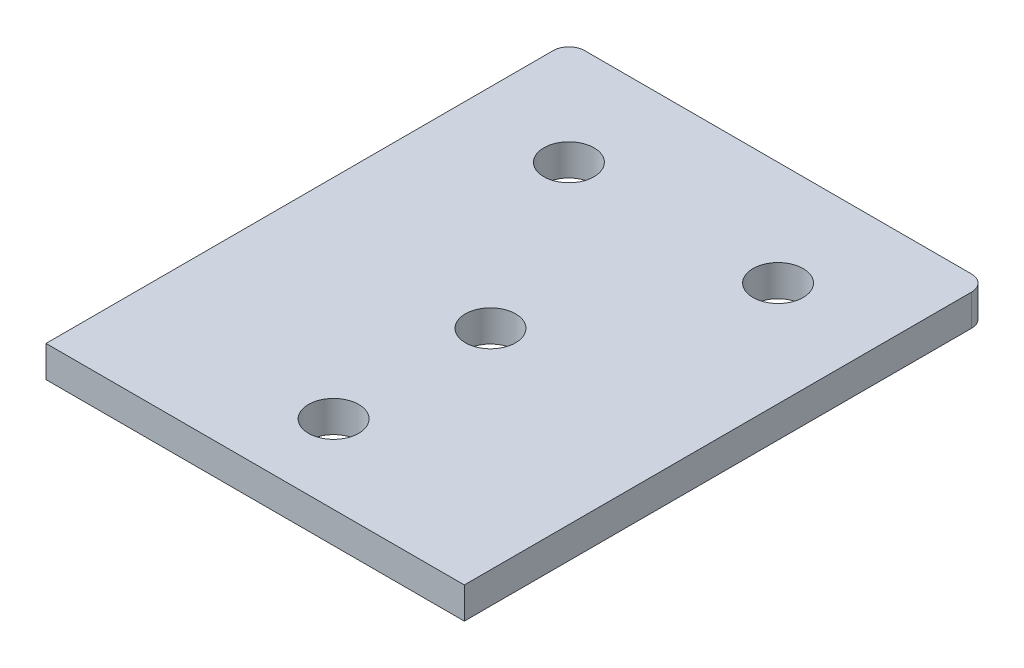
ISO-10303-21;
HEADER;
FILE_DESCRIPTION(('STEP AP214'),'2;1');
FILE_NAME('part.step','',(''),(''),'','','');
FILE_SCHEMA(('AUTOMOTIVE_DESIGN { 1 0 10303 214 1 1 1 1 }'));
ENDSEC;
DATA;
#1=APPLICATION_CONTEXT('core data for automotive mechanical design processes');
#2=APPLICATION_PROTOCOL_DEFINITION('international standard','automotive_design',2000,#1);
#3=PRODUCT_CONTEXT('',#1,'mechanical');
#4=PRODUCT('Part','Part','',(#3));
#5=PRODUCT_RELATED_PRODUCT_CATEGORY('part','',(#4));
#6=PRODUCT_DEFINITION_FORMATION('','',#4);
#7=PRODUCT_DEFINITION_CONTEXT('part definition',#1,'design');
#8=PRODUCT_DEFINITION('design','',#6,#7);
#9=PRODUCT_DEFINITION_SHAPE('','',#8);
#10=(LENGTH_UNIT() NAMED_UNIT(*) SI_UNIT(.MILLI.,.METRE.));
#11=(NAMED_UNIT(*) PLANE_ANGLE_UNIT() SI_UNIT($,.RADIAN.));
#12=(NAMED_UNIT(*) SI_UNIT($,.STERADIAN.) SOLID_ANGLE_UNIT());
#13=UNCERTAINTY_MEASURE_WITH_UNIT(LENGTH_MEASURE(1.E-05),#10,'distance_accuracy_value','');
#14=(GEOMETRIC_REPRESENTATION_CONTEXT(3) GLOBAL_UNCERTAINTY_ASSIGNED_CONTEXT((#13)) GLOBAL_UNIT_ASSIGNED_CONTEXT((#10,
#11,#12)) REPRESENTATION_CONTEXT('',''));
#15=CARTESIAN_POINT('',(0.,0.,0.));
#16=DIRECTION('',(0.,0.,1.));
#17=DIRECTION('',(1.,0.,0.));
#18=AXIS2_PLACEMENT_3D('',#15,#16,#17);
#19=CARTESIAN_POINT('',(-18.5,3.,-8.5));
#20=DIRECTION('',(0.,1.,0.));
#21=DIRECTION('',(0.,0.,1.));
#22=AXIS2_PLACEMENT_3D('',#19,#20,#21);
#23=PLANE('',#22);
#24=CARTESIAN_POINT('',(-10.,3.,0.));
#25=DIRECTION('',(0.,1.,0.));
#26=DIRECTION('',(0.,0.,1.));
#27=AXIS2_PLACEMENT_3D('',#24,#25,#26);
#28=CIRCLE('',#27,2.4);
#29=CARTESIAN_POINT('',(-10.,3.,2.4));
#30=VERTEX_POINT('',#29);
#31=EDGE_CURVE('E199',#30,#30,#28,.T.);
#32=ORIENTED_EDGE('',*,*,#31,.F.);
#33=EDGE_LOOP('',(#32));
#34=FACE_BOUND('',#33,.T.);
#35=CARTESIAN_POINT('',(0.,3.,32.5));
#36=DIRECTION('',(0.,1.,0.));
#37=DIRECTION('',(0.,0.,1.));
#38=AXIS2_PLACEMENT_3D('',#35,#36,#37);
#39=CIRCLE('',#38,2.4);
#40=CARTESIAN_POINT('',(0.,3.,34.9));
#41=VERTEX_POINT('',#40);
#42=EDGE_CURVE('E132',#41,#41,#39,.T.);
#43=ORIENTED_EDGE('',*,*,#42,.F.);
#44=EDGE_LOOP('',(#43));
#45=FACE_BOUND('',#44,.T.);
#46=CARTESIAN_POINT('',(-18.5,3.,-8.5));
#47=DIRECTION('',(0.,1.,0.));
#48=DIRECTION('',(0.,0.,1.));
#49=AXIS2_PLACEMENT_3D('',#46,#47,#48);
#50=CIRCLE('',#49,1.5);
#51=CARTESIAN_POINT('',(-18.5,3.,-10.));
#52=VERTEX_POINT('',#51);
#53=CARTESIAN_POINT('',(-20.,3.,-8.49999999999999));
#54=VERTEX_POINT('',#53);
#55=EDGE_CURVE('E139',#52,#54,#50,.T.);
#56=ORIENTED_EDGE('',*,*,#55,.T.);
#57=DIRECTION('',(0.,0.,1.));
#58=VECTOR('',#57,1.);
#59=CARTESIAN_POINT('',(-20.,3.,-8.49999999999999));
#60=LINE('',#59,#58);
#61=CARTESIAN_POINT('',(-20.,3.,40.));
#62=VERTEX_POINT('',#61);
#63=EDGE_CURVE('E97',#54,#62,#60,.T.);
#64=ORIENTED_EDGE('',*,*,#63,.T.);
#65=DIRECTION('',(1.,0.,0.));
#66=VECTOR('',#65,1.);
#67=CARTESIAN_POINT('',(-20.,3.,40.));
#68=LINE('',#67,#66);
#69=CARTESIAN_POINT('',(20.,3.,40.));
#70=VERTEX_POINT('',#69);
#71=EDGE_CURVE('E110',#62,#70,#68,.T.);
#72=ORIENTED_EDGE('',*,*,#71,.T.);
#73=DIRECTION('',(0.,0.,-1.));
#74=VECTOR('',#73,1.);
#75=CARTESIAN_POINT('',(20.,3.,-8.49999999999999));
#76=LINE('',#75,#74);
#77=CARTESIAN_POINT('',(20.,3.,-8.49999999999999));
#78=VERTEX_POINT('',#77);
#79=EDGE_CURVE('E104',#70,#78,#76,.T.);
#80=ORIENTED_EDGE('',*,*,#79,.T.);
#81=CARTESIAN_POINT('',(18.5,3.,-8.5));
#82=DIRECTION('',(0.,1.,0.));
#83=DIRECTION('',(0.,0.,-1.));
#84=AXIS2_PLACEMENT_3D('',#81,#82,#83);
#85=CIRCLE('',#84,1.5);
#86=CARTESIAN_POINT('',(18.5,3.,-10.));
#87=VERTEX_POINT('',#86);
#88=EDGE_CURVE('E108',#78,#87,#85,.T.);
#89=ORIENTED_EDGE('',*,*,#88,.T.);
#90=DIRECTION('',(-1.,0.,0.));
#91=VECTOR('',#90,1.);
#92=CARTESIAN_POINT('',(-18.5,3.,-10.));
#93=LINE('',#92,#91);
#94=EDGE_CURVE('E60',#87,#52,#93,.T.);
#95=ORIENTED_EDGE('',*,*,#94,.T.);
#96=EDGE_LOOP('',(#56,#64,#72,#80,#89,#95));
#97=FACE_BOUND('',#96,.T.);
#98=CARTESIAN_POINT('',(0.,3.,17.5));
#99=DIRECTION('',(0.,1.,0.));
#100=DIRECTION('',(0.,0.,1.));
#101=AXIS2_PLACEMENT_3D('',#98,#99,#100);
#102=CIRCLE('',#101,2.4);
#103=CARTESIAN_POINT('',(0.,3.,19.9));
#104=VERTEX_POINT('',#103);
#105=EDGE_CURVE('E205',#104,#104,#102,.T.);
#106=ORIENTED_EDGE('',*,*,#105,.F.);
#107=EDGE_LOOP('',(#106));
#108=FACE_BOUND('',#107,.T.);
#109=CARTESIAN_POINT('',(10.,3.,0.));
#110=DIRECTION('',(0.,1.,0.));
#111=DIRECTION('',(0.,0.,1.));
#112=AXIS2_PLACEMENT_3D('',#109,#110,#111);
#113=CIRCLE('',#112,2.4);
#114=CARTESIAN_POINT('',(10.,3.,2.4));
#115=VERTEX_POINT('',#114);
#116=EDGE_CURVE('E190',#115,#115,#113,.T.);
#117=ORIENTED_EDGE('',*,*,#116,.F.);
#118=EDGE_LOOP('',(#117));
#119=FACE_BOUND('',#118,.T.);
#120=ADVANCED_FACE('F43',(#34,#45,#97,#108,#119),#23,.T.);
#121=CARTESIAN_POINT('',(-18.5,0.,-8.5));
#122=DIRECTION('',(0.,1.,0.));
#123=DIRECTION('',(0.,0.,1.));
#124=AXIS2_PLACEMENT_3D('',#121,#122,#123);
#125=PLANE('',#124);
#126=CARTESIAN_POINT('',(-18.5,0.,-8.5));
#127=DIRECTION('',(0.,1.,0.));
#128=DIRECTION('',(0.,0.,1.));
#129=AXIS2_PLACEMENT_3D('',#126,#127,#128);
#130=CIRCLE('',#129,1.5);
#131=CARTESIAN_POINT('',(-18.5,0.,-10.));
#132=VERTEX_POINT('',#131);
#133=CARTESIAN_POINT('',(-20.,0.,-8.49999999999999));
#134=VERTEX_POINT('',#133);
#135=EDGE_CURVE('E128',#132,#134,#130,.T.);
#136=ORIENTED_EDGE('',*,*,#135,.F.);
#137=DIRECTION('',(-1.,0.,0.));
#138=VECTOR('',#137,1.);
#139=CARTESIAN_POINT('',(-18.5,0.,-10.));
#140=LINE('',#139,#138);
#141=CARTESIAN_POINT('',(18.5,0.,-10.));
#142=VERTEX_POINT('',#141);
#143=EDGE_CURVE('E89',#142,#132,#140,.T.);
#144=ORIENTED_EDGE('',*,*,#143,.F.);
#145=CARTESIAN_POINT('',(18.5,0.,-8.5));
#146=DIRECTION('',(0.,1.,0.));
#147=DIRECTION('',(0.,0.,-1.));
#148=AXIS2_PLACEMENT_3D('',#145,#146,#147);
#149=CIRCLE('',#148,1.5);
#150=CARTESIAN_POINT('',(20.,0.,-8.49999999999999));
#151=VERTEX_POINT('',#150);
#152=EDGE_CURVE('E83',#151,#142,#149,.T.);
#153=ORIENTED_EDGE('',*,*,#152,.F.);
#154=DIRECTION('',(0.,0.,-1.));
#155=VECTOR('',#154,1.);
#156=CARTESIAN_POINT('',(20.,0.,-8.49999999999999));
#157=LINE('',#156,#155);
#158=CARTESIAN_POINT('',(20.,0.,40.));
#159=VERTEX_POINT('',#158);
#160=EDGE_CURVE('E118',#159,#151,#157,.T.);
#161=ORIENTED_EDGE('',*,*,#160,.F.);
#162=DIRECTION('',(1.,0.,0.));
#163=VECTOR('',#162,1.);
#164=CARTESIAN_POINT('',(-20.,0.,40.));
#165=LINE('',#164,#163);
#166=CARTESIAN_POINT('',(-20.,0.,40.));
#167=VERTEX_POINT('',#166);
#168=EDGE_CURVE('E134',#167,#159,#165,.T.);
#169=ORIENTED_EDGE('',*,*,#168,.F.);
#170=DIRECTION('',(0.,0.,1.));
#171=VECTOR('',#170,1.);
#172=CARTESIAN_POINT('',(-20.,0.,-8.49999999999999));
#173=LINE('',#172,#171);
#174=EDGE_CURVE('E131',#134,#167,#173,.T.);
#175=ORIENTED_EDGE('',*,*,#174,.F.);
#176=EDGE_LOOP('',(#136,#144,#153,#161,#169,#175));
#177=FACE_BOUND('',#176,.T.);
#178=CARTESIAN_POINT('',(0.,0.,32.5));
#179=DIRECTION('',(0.,1.,0.));
#180=DIRECTION('',(0.,0.,1.));
#181=AXIS2_PLACEMENT_3D('',#178,#179,#180);
#182=CIRCLE('',#181,2.4);
#183=CARTESIAN_POINT('',(0.,0.,34.9));
#184=VERTEX_POINT('',#183);
#185=EDGE_CURVE('E208',#184,#184,#182,.T.);
#186=ORIENTED_EDGE('',*,*,#185,.T.);
#187=EDGE_LOOP('',(#186));
#188=FACE_BOUND('',#187,.T.);
#189=CARTESIAN_POINT('',(0.,0.,17.5));
#190=DIRECTION('',(0.,1.,0.));
#191=DIRECTION('',(0.,0.,1.));
#192=AXIS2_PLACEMENT_3D('',#189,#190,#191);
#193=CIRCLE('',#192,2.4);
#194=CARTESIAN_POINT('',(0.,0.,19.9));
#195=VERTEX_POINT('',#194);
#196=EDGE_CURVE('E202',#195,#195,#193,.T.);
#197=ORIENTED_EDGE('',*,*,#196,.T.);
#198=EDGE_LOOP('',(#197));
#199=FACE_BOUND('',#198,.T.);
#200=CARTESIAN_POINT('',(-10.,0.,0.));
#201=DIRECTION('',(0.,1.,0.));
#202=DIRECTION('',(0.,0.,1.));
#203=AXIS2_PLACEMENT_3D('',#200,#201,#202);
#204=CIRCLE('',#203,2.4);
#205=CARTESIAN_POINT('',(-10.,0.,2.4));
#206=VERTEX_POINT('',#205);
#207=EDGE_CURVE('E196',#206,#206,#204,.T.);
#208=ORIENTED_EDGE('',*,*,#207,.T.);
#209=EDGE_LOOP('',(#208));
#210=FACE_BOUND('',#209,.T.);
#211=CARTESIAN_POINT('',(10.,0.,0.));
#212=DIRECTION('',(0.,1.,0.));
#213=DIRECTION('',(0.,0.,1.));
#214=AXIS2_PLACEMENT_3D('',#211,#212,#213);
#215=CIRCLE('',#214,2.4);
#216=CARTESIAN_POINT('',(10.,0.,2.4));
#217=VERTEX_POINT('',#216);
#218=EDGE_CURVE('E193',#217,#217,#215,.T.);
#219=ORIENTED_EDGE('',*,*,#218,.T.);
#220=EDGE_LOOP('',(#219));
#221=FACE_BOUND('',#220,.T.);
#222=ADVANCED_FACE('F148',(#177,#188,#199,#210,#221),#125,.F.);
#223=CARTESIAN_POINT('',(-18.5,3.,-8.5));
#224=DIRECTION('',(0.,-1.,0.));
#225=DIRECTION('',(0.,0.,-1.));
#226=AXIS2_PLACEMENT_3D('',#223,#224,#225);
#227=CYLINDRICAL_SURFACE('',#226,1.5);
#228=ORIENTED_EDGE('',*,*,#135,.T.);
#229=DIRECTION('',(0.,-1.,0.));
#230=VECTOR('',#229,1.);
#231=CARTESIAN_POINT('',(-20.,3.,-8.49999999999999));
#232=LINE('',#231,#230);
#233=EDGE_CURVE('E13',#54,#134,#232,.T.);
#234=ORIENTED_EDGE('',*,*,#233,.F.);
#235=ORIENTED_EDGE('',*,*,#55,.F.);
#236=DIRECTION('',(0.,-1.,0.));
#237=VECTOR('',#236,1.);
#238=CARTESIAN_POINT('',(-18.5,3.,-10.));
#239=LINE('',#238,#237);
#240=EDGE_CURVE('E124',#52,#132,#239,.T.);
#241=ORIENTED_EDGE('',*,*,#240,.T.);
#242=EDGE_LOOP('',(#228,#234,#235,#241));
#243=FACE_BOUND('',#242,.T.);
#244=ADVANCED_FACE('F45',(#243),#227,.T.);
#245=CARTESIAN_POINT('',(-20.,3.,-8.49999999999999));
#246=DIRECTION('',(1.,0.,0.));
#247=DIRECTION('',(0.,0.,-1.));
#248=AXIS2_PLACEMENT_3D('',#245,#246,#247);
#249=PLANE('',#248);
#250=ORIENTED_EDGE('',*,*,#174,.T.);
#251=DIRECTION('',(0.,-1.,0.));
#252=VECTOR('',#251,1.);
#253=CARTESIAN_POINT('',(-20.,3.,40.));
#254=LINE('',#253,#252);
#255=EDGE_CURVE('E52',#62,#167,#254,.T.);
#256=ORIENTED_EDGE('',*,*,#255,.F.);
#257=ORIENTED_EDGE('',*,*,#63,.F.);
#258=ORIENTED_EDGE('',*,*,#233,.T.);
#259=EDGE_LOOP('',(#250,#256,#257,#258));
#260=FACE_BOUND('',#259,.T.);
#261=ADVANCED_FACE('F266',(#260),#249,.F.);
#262=CARTESIAN_POINT('',(-20.,3.,40.));
#263=DIRECTION('',(0.,0.,-1.));
#264=DIRECTION('',(-1.,0.,0.));
#265=AXIS2_PLACEMENT_3D('',#262,#263,#264);
#266=PLANE('',#265);
#267=ORIENTED_EDGE('',*,*,#168,.T.);
#268=DIRECTION('',(0.,-1.,0.));
#269=VECTOR('',#268,1.);
#270=CARTESIAN_POINT('',(20.,3.,40.));
#271=LINE('',#270,#269);
#272=EDGE_CURVE('E119',#70,#159,#271,.T.);
#273=ORIENTED_EDGE('',*,*,#272,.F.);
#274=ORIENTED_EDGE('',*,*,#71,.F.);
#275=ORIENTED_EDGE('',*,*,#255,.T.);
#276=EDGE_LOOP('',(#267,#273,#274,#275));
#277=FACE_BOUND('',#276,.T.);
#278=ADVANCED_FACE('F145',(#277),#266,.F.);
#279=CARTESIAN_POINT('',(20.,3.,-8.49999999999999));
#280=DIRECTION('',(-1.,0.,0.));
#281=DIRECTION('',(0.,0.,1.));
#282=AXIS2_PLACEMENT_3D('',#279,#280,#281);
#283=PLANE('',#282);
#284=ORIENTED_EDGE('',*,*,#160,.T.);
#285=DIRECTION('',(0.,-1.,0.));
#286=VECTOR('',#285,1.);
#287=CARTESIAN_POINT('',(20.,3.,-8.49999999999999));
#288=LINE('',#287,#286);
#289=EDGE_CURVE('E115',#78,#151,#288,.T.);
#290=ORIENTED_EDGE('',*,*,#289,.F.);
#291=ORIENTED_EDGE('',*,*,#79,.F.);
#292=ORIENTED_EDGE('',*,*,#272,.T.);
#293=EDGE_LOOP('',(#284,#290,#291,#292));
#294=FACE_BOUND('',#293,.T.);
#295=ADVANCED_FACE('F116',(#294),#283,.F.);
#296=CARTESIAN_POINT('',(18.5,3.,-8.5));
#297=DIRECTION('',(0.,-1.,0.));
#298=DIRECTION('',(0.,0.,-1.));
#299=AXIS2_PLACEMENT_3D('',#296,#297,#298);
#300=CYLINDRICAL_SURFACE('',#299,1.5);
#301=ORIENTED_EDGE('',*,*,#152,.T.);
#302=DIRECTION('',(0.,-1.,0.));
#303=VECTOR('',#302,1.);
#304=CARTESIAN_POINT('',(18.5,3.,-10.));
#305=LINE('',#304,#303);
#306=EDGE_CURVE('E120',#87,#142,#305,.T.);
#307=ORIENTED_EDGE('',*,*,#306,.F.);
#308=ORIENTED_EDGE('',*,*,#88,.F.);
#309=ORIENTED_EDGE('',*,*,#289,.T.);
#310=EDGE_LOOP('',(#301,#307,#308,#309));
#311=FACE_BOUND('',#310,.T.);
#312=ADVANCED_FACE('F122',(#311),#300,.T.);
#313=CARTESIAN_POINT('',(-18.5,3.,-10.));
#314=DIRECTION('',(0.,0.,1.));
#315=DIRECTION('',(1.,0.,0.));
#316=AXIS2_PLACEMENT_3D('',#313,#314,#315);
#317=PLANE('',#316);
#318=ORIENTED_EDGE('',*,*,#143,.T.);
#319=ORIENTED_EDGE('',*,*,#240,.F.);
#320=ORIENTED_EDGE('',*,*,#94,.F.);
#321=ORIENTED_EDGE('',*,*,#306,.T.);
#322=EDGE_LOOP('',(#318,#319,#320,#321));
#323=FACE_BOUND('',#322,.T.);
#324=ADVANCED_FACE('F153',(#323),#317,.F.);
#325=CARTESIAN_POINT('',(0.,3.,32.5));
#326=DIRECTION('',(0.,-1.,0.));
#327=DIRECTION('',(0.,0.,-1.));
#328=AXIS2_PLACEMENT_3D('',#325,#326,#327);
#329=CYLINDRICAL_SURFACE('',#328,2.4);
#330=ORIENTED_EDGE('',*,*,#42,.T.);
#331=EDGE_LOOP('',(#330));
#332=FACE_BOUND('',#331,.T.);
#333=ORIENTED_EDGE('',*,*,#185,.F.);
#334=EDGE_LOOP('',(#333));
#335=FACE_BOUND('',#334,.T.);
#336=ADVANCED_FACE('F155',(#332,#335),#329,.F.);
#337=CARTESIAN_POINT('',(0.,3.,17.5));
#338=DIRECTION('',(0.,-1.,0.));
#339=DIRECTION('',(0.,0.,-1.));
#340=AXIS2_PLACEMENT_3D('',#337,#338,#339);
#341=CYLINDRICAL_SURFACE('',#340,2.4);
#342=ORIENTED_EDGE('',*,*,#105,.T.);
#343=EDGE_LOOP('',(#342));
#344=FACE_BOUND('',#343,.T.);
#345=ORIENTED_EDGE('',*,*,#196,.F.);
#346=EDGE_LOOP('',(#345));
#347=FACE_BOUND('',#346,.T.);
#348=ADVANCED_FACE('F161',(#344,#347),#341,.F.);
#349=CARTESIAN_POINT('',(-10.,3.,0.));
#350=DIRECTION('',(0.,-1.,0.));
#351=DIRECTION('',(0.,0.,-1.));
#352=AXIS2_PLACEMENT_3D('',#349,#350,#351);
#353=CYLINDRICAL_SURFACE('',#352,2.4);
#354=ORIENTED_EDGE('',*,*,#31,.T.);
#355=EDGE_LOOP('',(#354));
#356=FACE_BOUND('',#355,.T.);
#357=ORIENTED_EDGE('',*,*,#207,.F.);
#358=EDGE_LOOP('',(#357));
#359=FACE_BOUND('',#358,.T.);
#360=ADVANCED_FACE('F177',(#356,#359),#353,.F.);
#361=CARTESIAN_POINT('',(10.,3.,0.));
#362=DIRECTION('',(0.,-1.,0.));
#363=DIRECTION('',(0.,0.,-1.));
#364=AXIS2_PLACEMENT_3D('',#361,#362,#363);
#365=CYLINDRICAL_SURFACE('',#364,2.4);
#366=ORIENTED_EDGE('',*,*,#116,.T.);
#367=EDGE_LOOP('',(#366));
#368=FACE_BOUND('',#367,.T.);
#369=ORIENTED_EDGE('',*,*,#218,.F.);
#370=EDGE_LOOP('',(#369));
#371=FACE_BOUND('',#370,.T.);
#372=ADVANCED_FACE('F181',(#368,#371),#365,.F.);
#373=CLOSED_SHELL('',(#120,#222,#244,#261,#278,#295,#312,#324,#336,#348,#360,#372));
#374=MANIFOLD_SOLID_BREP('B2',#373);
#375=ADVANCED_BREP_SHAPE_REPRESENTATION('',(#18,#374),#14);
#376=SHAPE_DEFINITION_REPRESENTATION(#9,#375);
ENDSEC;
END-ISO-10303-21;
